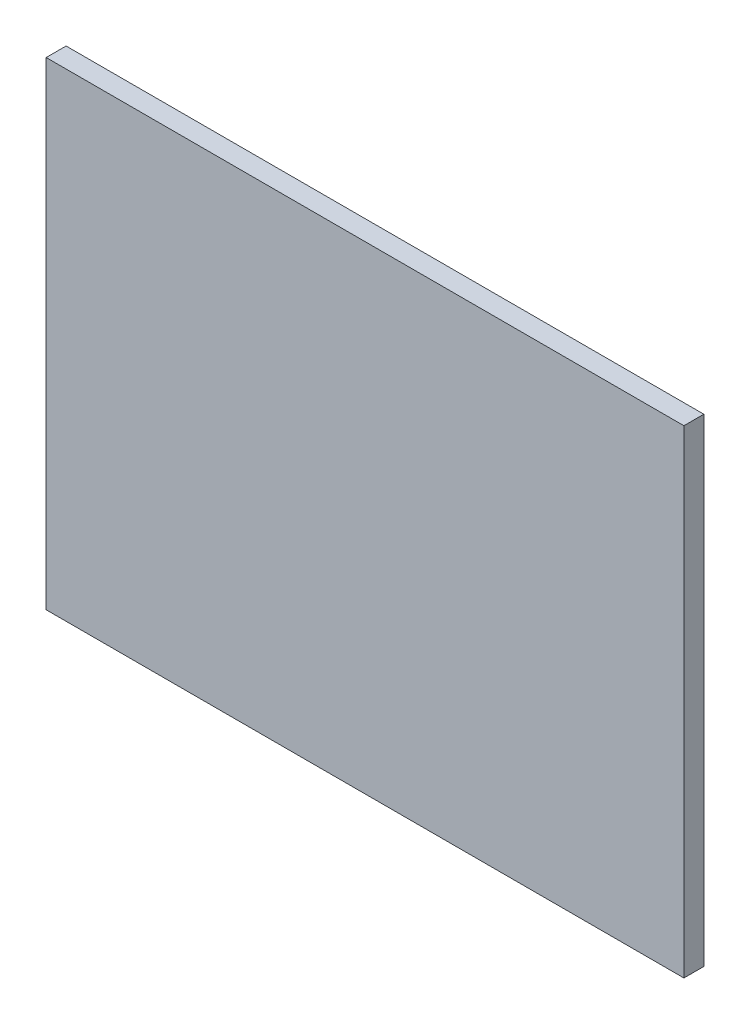
ISO-10303-21;
HEADER;
FILE_DESCRIPTION(('STEP AP214'),'2;1');
FILE_NAME('part.step','',(''),(''),'','','');
FILE_SCHEMA(('AUTOMOTIVE_DESIGN { 1 0 10303 214 1 1 1 1 }'));
ENDSEC;
DATA;
#1=APPLICATION_CONTEXT('core data for automotive mechanical design processes');
#2=APPLICATION_PROTOCOL_DEFINITION('international standard','automotive_design',2000,#1);
#3=PRODUCT_CONTEXT('',#1,'mechanical');
#4=PRODUCT('Part','Part','',(#3));
#5=PRODUCT_RELATED_PRODUCT_CATEGORY('part','',(#4));
#6=PRODUCT_DEFINITION_FORMATION('','',#4);
#7=PRODUCT_DEFINITION_CONTEXT('part definition',#1,'design');
#8=PRODUCT_DEFINITION('design','',#6,#7);
#9=PRODUCT_DEFINITION_SHAPE('','',#8);
#10=(LENGTH_UNIT() NAMED_UNIT(*) SI_UNIT(.MILLI.,.METRE.));
#11=(NAMED_UNIT(*) PLANE_ANGLE_UNIT() SI_UNIT($,.RADIAN.));
#12=(NAMED_UNIT(*) SI_UNIT($,.STERADIAN.) SOLID_ANGLE_UNIT());
#13=UNCERTAINTY_MEASURE_WITH_UNIT(LENGTH_MEASURE(1.E-05),#10,'distance_accuracy_value','');
#14=(GEOMETRIC_REPRESENTATION_CONTEXT(3) GLOBAL_UNCERTAINTY_ASSIGNED_CONTEXT((#13)) GLOBAL_UNIT_ASSIGNED_CONTEXT((#10,
#11,#12)) REPRESENTATION_CONTEXT('',''));
#15=CARTESIAN_POINT('',(0.,0.,0.));
#16=DIRECTION('',(0.,0.,1.));
#17=DIRECTION('',(1.,0.,0.));
#18=AXIS2_PLACEMENT_3D('',#15,#16,#17);
#19=CARTESIAN_POINT('',(-25.4,-19.05,1.5875));
#20=DIRECTION('',(1.,0.,0.));
#21=DIRECTION('',(0.,0.,-1.));
#22=AXIS2_PLACEMENT_3D('',#19,#20,#21);
#23=PLANE('',#22);
#24=DIRECTION('',(0.,-1.,0.));
#25=VECTOR('',#24,1.);
#26=CARTESIAN_POINT('',(-25.4,-19.05,0.));
#27=LINE('',#26,#25);
#28=CARTESIAN_POINT('',(-25.4,19.05,0.));
#29=VERTEX_POINT('',#28);
#30=CARTESIAN_POINT('',(-25.4,-19.05,0.));
#31=VERTEX_POINT('',#30);
#32=EDGE_CURVE('E97',#29,#31,#27,.T.);
#33=ORIENTED_EDGE('',*,*,#32,.T.);
#34=DIRECTION('',(0.,0.,-1.));
#35=VECTOR('',#34,1.);
#36=CARTESIAN_POINT('',(-25.4,-19.05,1.5875));
#37=LINE('',#36,#35);
#38=CARTESIAN_POINT('',(-25.4,-19.05,1.5875));
#39=VERTEX_POINT('',#38);
#40=EDGE_CURVE('E11',#39,#31,#37,.T.);
#41=ORIENTED_EDGE('',*,*,#40,.F.);
#42=DIRECTION('',(0.,-1.,0.));
#43=VECTOR('',#42,1.);
#44=CARTESIAN_POINT('',(-25.4,-19.05,1.5875));
#45=LINE('',#44,#43);
#46=CARTESIAN_POINT('',(-25.4,19.05,1.5875));
#47=VERTEX_POINT('',#46);
#48=EDGE_CURVE('E85',#47,#39,#45,.T.);
#49=ORIENTED_EDGE('',*,*,#48,.F.);
#50=DIRECTION('',(0.,0.,-1.));
#51=VECTOR('',#50,1.);
#52=CARTESIAN_POINT('',(-25.4,19.05,1.5875));
#53=LINE('',#52,#51);
#54=EDGE_CURVE('E93',#47,#29,#53,.T.);
#55=ORIENTED_EDGE('',*,*,#54,.T.);
#56=EDGE_LOOP('',(#33,#41,#49,#55));
#57=FACE_BOUND('',#56,.T.);
#58=ADVANCED_FACE('F34',(#57),#23,.F.);
#59=CARTESIAN_POINT('',(25.4,-19.05,1.5875));
#60=DIRECTION('',(0.,1.,0.));
#61=DIRECTION('',(-1.,0.,0.));
#62=AXIS2_PLACEMENT_3D('',#59,#60,#61);
#63=PLANE('',#62);
#64=DIRECTION('',(1.,0.,0.));
#65=VECTOR('',#64,1.);
#66=CARTESIAN_POINT('',(25.4,-19.05,0.));
#67=LINE('',#66,#65);
#68=CARTESIAN_POINT('',(25.4,-19.05,0.));
#69=VERTEX_POINT('',#68);
#70=EDGE_CURVE('E89',#31,#69,#67,.T.);
#71=ORIENTED_EDGE('',*,*,#70,.T.);
#72=DIRECTION('',(0.,0.,-1.));
#73=VECTOR('',#72,1.);
#74=CARTESIAN_POINT('',(25.4,-19.05,1.5875));
#75=LINE('',#74,#73);
#76=CARTESIAN_POINT('',(25.4,-19.05,1.5875));
#77=VERTEX_POINT('',#76);
#78=EDGE_CURVE('E42',#77,#69,#75,.T.);
#79=ORIENTED_EDGE('',*,*,#78,.F.);
#80=DIRECTION('',(1.,0.,0.));
#81=VECTOR('',#80,1.);
#82=CARTESIAN_POINT('',(25.4,-19.05,1.5875));
#83=LINE('',#82,#81);
#84=EDGE_CURVE('E80',#39,#77,#83,.T.);
#85=ORIENTED_EDGE('',*,*,#84,.F.);
#86=ORIENTED_EDGE('',*,*,#40,.T.);
#87=EDGE_LOOP('',(#71,#79,#85,#86));
#88=FACE_BOUND('',#87,.T.);
#89=ADVANCED_FACE('F88',(#88),#63,.F.);
#90=CARTESIAN_POINT('',(25.4,-19.05,1.5875));
#91=DIRECTION('',(-1.,0.,0.));
#92=DIRECTION('',(0.,0.,1.));
#93=AXIS2_PLACEMENT_3D('',#90,#91,#92);
#94=PLANE('',#93);
#95=DIRECTION('',(0.,1.,0.));
#96=VECTOR('',#95,1.);
#97=CARTESIAN_POINT('',(25.4,-19.05,0.));
#98=LINE('',#97,#96);
#99=CARTESIAN_POINT('',(25.4,19.05,0.));
#100=VERTEX_POINT('',#99);
#101=EDGE_CURVE('E67',#69,#100,#98,.T.);
#102=ORIENTED_EDGE('',*,*,#101,.T.);
#103=DIRECTION('',(0.,0.,-1.));
#104=VECTOR('',#103,1.);
#105=CARTESIAN_POINT('',(25.4,19.05,1.5875));
#106=LINE('',#105,#104);
#107=CARTESIAN_POINT('',(25.4,19.05,1.5875));
#108=VERTEX_POINT('',#107);
#109=EDGE_CURVE('E90',#108,#100,#106,.T.);
#110=ORIENTED_EDGE('',*,*,#109,.F.);
#111=DIRECTION('',(0.,1.,0.));
#112=VECTOR('',#111,1.);
#113=CARTESIAN_POINT('',(25.4,-19.05,1.5875));
#114=LINE('',#113,#112);
#115=EDGE_CURVE('E83',#77,#108,#114,.T.);
#116=ORIENTED_EDGE('',*,*,#115,.F.);
#117=ORIENTED_EDGE('',*,*,#78,.T.);
#118=EDGE_LOOP('',(#102,#110,#116,#117));
#119=FACE_BOUND('',#118,.T.);
#120=ADVANCED_FACE('F91',(#119),#94,.F.);
#121=CARTESIAN_POINT('',(25.4,19.05,1.5875));
#122=DIRECTION('',(0.,-1.,0.));
#123=DIRECTION('',(1.,0.,0.));
#124=AXIS2_PLACEMENT_3D('',#121,#122,#123);
#125=PLANE('',#124);
#126=DIRECTION('',(-1.,0.,0.));
#127=VECTOR('',#126,1.);
#128=CARTESIAN_POINT('',(25.4,19.05,0.));
#129=LINE('',#128,#127);
#130=EDGE_CURVE('E73',#100,#29,#129,.T.);
#131=ORIENTED_EDGE('',*,*,#130,.T.);
#132=ORIENTED_EDGE('',*,*,#54,.F.);
#133=DIRECTION('',(-1.,0.,0.));
#134=VECTOR('',#133,1.);
#135=CARTESIAN_POINT('',(25.4,19.05,1.5875));
#136=LINE('',#135,#134);
#137=EDGE_CURVE('E50',#108,#47,#136,.T.);
#138=ORIENTED_EDGE('',*,*,#137,.F.);
#139=ORIENTED_EDGE('',*,*,#109,.T.);
#140=EDGE_LOOP('',(#131,#132,#138,#139));
#141=FACE_BOUND('',#140,.T.);
#142=ADVANCED_FACE('F104',(#141),#125,.F.);
#143=CARTESIAN_POINT('',(0.,0.,1.5875));
#144=DIRECTION('',(0.,0.,1.));
#145=DIRECTION('',(1.,0.,0.));
#146=AXIS2_PLACEMENT_3D('',#143,#144,#145);
#147=PLANE('',#146);
#148=ORIENTED_EDGE('',*,*,#48,.T.);
#149=ORIENTED_EDGE('',*,*,#84,.T.);
#150=ORIENTED_EDGE('',*,*,#115,.T.);
#151=ORIENTED_EDGE('',*,*,#137,.T.);
#152=EDGE_LOOP('',(#148,#149,#150,#151));
#153=FACE_BOUND('',#152,.T.);
#154=ADVANCED_FACE('F81',(#153),#147,.T.);
#155=CARTESIAN_POINT('',(0.,0.,0.));
#156=DIRECTION('',(0.,0.,1.));
#157=DIRECTION('',(1.,0.,0.));
#158=AXIS2_PLACEMENT_3D('',#155,#156,#157);
#159=PLANE('',#158);
#160=ORIENTED_EDGE('',*,*,#32,.F.);
#161=ORIENTED_EDGE('',*,*,#130,.F.);
#162=ORIENTED_EDGE('',*,*,#101,.F.);
#163=ORIENTED_EDGE('',*,*,#70,.F.);
#164=EDGE_LOOP('',(#160,#161,#162,#163));
#165=FACE_BOUND('',#164,.T.);
#166=ADVANCED_FACE('F107',(#165),#159,.F.);
#167=CLOSED_SHELL('',(#58,#89,#120,#142,#154,#166));
#168=MANIFOLD_SOLID_BREP('B2',#167);
#169=ADVANCED_BREP_SHAPE_REPRESENTATION('',(#18,#168),#14);
#170=SHAPE_DEFINITION_REPRESENTATION(#9,#169);
ENDSEC;
END-ISO-10303-21;
